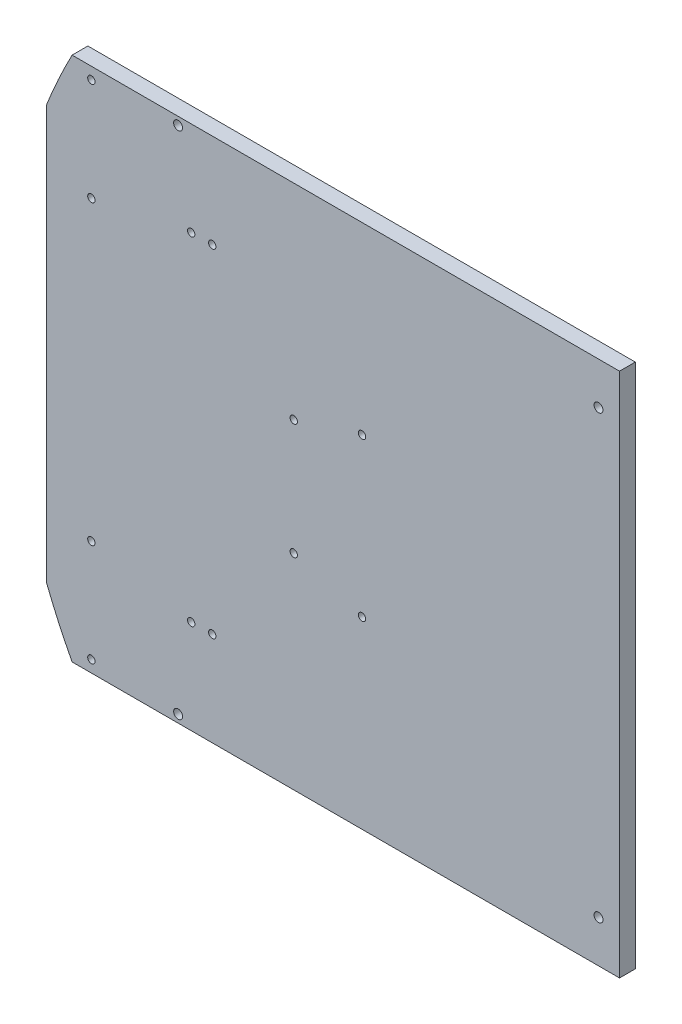
ISO-10303-21;
HEADER;
FILE_DESCRIPTION(('STEP AP214'),'2;1');
FILE_NAME('part.step','',(''),(''),'','','');
FILE_SCHEMA(('AUTOMOTIVE_DESIGN { 1 0 10303 214 1 1 1 1 }'));
ENDSEC;
DATA;
#1=APPLICATION_CONTEXT('core data for automotive mechanical design processes');
#2=APPLICATION_PROTOCOL_DEFINITION('international standard','automotive_design',2000,#1);
#3=PRODUCT_CONTEXT('',#1,'mechanical');
#4=PRODUCT('Part','Part','',(#3));
#5=PRODUCT_RELATED_PRODUCT_CATEGORY('part','',(#4));
#6=PRODUCT_DEFINITION_FORMATION('','',#4);
#7=PRODUCT_DEFINITION_CONTEXT('part definition',#1,'design');
#8=PRODUCT_DEFINITION('design','',#6,#7);
#9=PRODUCT_DEFINITION_SHAPE('','',#8);
#10=(LENGTH_UNIT() NAMED_UNIT(*) SI_UNIT(.MILLI.,.METRE.));
#11=(NAMED_UNIT(*) PLANE_ANGLE_UNIT() SI_UNIT($,.RADIAN.));
#12=(NAMED_UNIT(*) SI_UNIT($,.STERADIAN.) SOLID_ANGLE_UNIT());
#13=UNCERTAINTY_MEASURE_WITH_UNIT(LENGTH_MEASURE(1.E-05),#10,'distance_accuracy_value','');
#14=(GEOMETRIC_REPRESENTATION_CONTEXT(3) GLOBAL_UNCERTAINTY_ASSIGNED_CONTEXT((#13)) GLOBAL_UNIT_ASSIGNED_CONTEXT((#10,
#11,#12)) REPRESENTATION_CONTEXT('',''));
#15=CARTESIAN_POINT('',(0.,0.,0.));
#16=DIRECTION('',(0.,0.,1.));
#17=DIRECTION('',(1.,0.,0.));
#18=AXIS2_PLACEMENT_3D('',#15,#16,#17);
#19=CARTESIAN_POINT('',(10.,84.,239.3));
#20=DIRECTION('',(0.,0.,1.));
#21=DIRECTION('',(1.,0.,0.));
#22=AXIS2_PLACEMENT_3D('',#19,#20,#21);
#23=CYLINDRICAL_SURFACE('',#22,1.7);
#24=DIRECTION('',(0.,0.,1.));
#25=VECTOR('',#24,1.);
#26=CARTESIAN_POINT('',(11.7,84.,239.3));
#27=LINE('',#26,#25);
#28=CARTESIAN_POINT('',(11.7,84.,239.5));
#29=VERTEX_POINT('',#28);
#30=CARTESIAN_POINT('',(11.7,84.,245.5));
#31=VERTEX_POINT('',#30);
#32=EDGE_CURVE('E9',#29,#31,#27,.T.);
#33=ORIENTED_EDGE('',*,*,#32,.F.);
#34=CARTESIAN_POINT('',(10.,84.,239.5));
#35=DIRECTION('',(0.,0.,1.));
#36=DIRECTION('',(1.,0.,0.));
#37=AXIS2_PLACEMENT_3D('',#34,#35,#36);
#38=CIRCLE('',#37,1.7);
#39=EDGE_CURVE('E360',#29,#29,#38,.T.);
#40=ORIENTED_EDGE('',*,*,#39,.F.);
#41=ORIENTED_EDGE('',*,*,#32,.T.);
#42=CARTESIAN_POINT('',(10.,84.,245.5));
#43=DIRECTION('',(0.,0.,1.));
#44=DIRECTION('',(1.,0.,0.));
#45=AXIS2_PLACEMENT_3D('',#42,#43,#44);
#46=CIRCLE('',#45,1.7);
#47=EDGE_CURVE('E289',#31,#31,#46,.T.);
#48=ORIENTED_EDGE('',*,*,#47,.T.);
#49=EDGE_LOOP('',(#33,#40,#41,#48));
#50=FACE_BOUND('',#49,.T.);
#51=ADVANCED_FACE('F14',(#50),#23,.F.);
#52=CARTESIAN_POINT('',(-80.,30.,239.4));
#53=DIRECTION('',(0.,0.,1.));
#54=DIRECTION('',(1.,0.,0.));
#55=AXIS2_PLACEMENT_3D('',#52,#53,#54);
#56=CYLINDRICAL_SURFACE('',#55,1.4);
#57=DIRECTION('',(0.,0.,1.));
#58=VECTOR('',#57,1.);
#59=CARTESIAN_POINT('',(-78.6,30.,239.4));
#60=LINE('',#59,#58);
#61=CARTESIAN_POINT('',(-78.6,30.,239.5));
#62=VERTEX_POINT('',#61);
#63=CARTESIAN_POINT('',(-78.6,30.,245.5));
#64=VERTEX_POINT('',#63);
#65=EDGE_CURVE('E25',#62,#64,#60,.T.);
#66=ORIENTED_EDGE('',*,*,#65,.F.);
#67=CARTESIAN_POINT('',(-80.,30.,239.5));
#68=DIRECTION('',(0.,0.,1.));
#69=DIRECTION('',(1.,0.,0.));
#70=AXIS2_PLACEMENT_3D('',#67,#68,#69);
#71=CIRCLE('',#70,1.4);
#72=EDGE_CURVE('E365',#62,#62,#71,.T.);
#73=ORIENTED_EDGE('',*,*,#72,.F.);
#74=ORIENTED_EDGE('',*,*,#65,.T.);
#75=CARTESIAN_POINT('',(-80.,30.,245.5));
#76=DIRECTION('',(0.,0.,1.));
#77=DIRECTION('',(1.,0.,0.));
#78=AXIS2_PLACEMENT_3D('',#75,#76,#77);
#79=CIRCLE('',#78,1.4);
#80=EDGE_CURVE('E353',#64,#64,#79,.T.);
#81=ORIENTED_EDGE('',*,*,#80,.T.);
#82=EDGE_LOOP('',(#66,#73,#74,#81));
#83=FACE_BOUND('',#82,.T.);
#84=ADVANCED_FACE('F584',(#83),#56,.F.);
#85=CARTESIAN_POINT('',(-150.,97.,239.3));
#86=DIRECTION('',(0.,0.,1.));
#87=DIRECTION('',(1.,0.,0.));
#88=AXIS2_PLACEMENT_3D('',#85,#86,#87);
#89=CYLINDRICAL_SURFACE('',#88,1.7);
#90=DIRECTION('',(0.,0.,1.));
#91=VECTOR('',#90,1.);
#92=CARTESIAN_POINT('',(-148.3,97.,239.3));
#93=LINE('',#92,#91);
#94=CARTESIAN_POINT('',(-148.3,97.,239.5));
#95=VERTEX_POINT('',#94);
#96=CARTESIAN_POINT('',(-148.3,97.,245.5));
#97=VERTEX_POINT('',#96);
#98=EDGE_CURVE('E320',#95,#97,#93,.T.);
#99=ORIENTED_EDGE('',*,*,#98,.F.);
#100=CARTESIAN_POINT('',(-150.,97.,239.5));
#101=DIRECTION('',(0.,0.,1.));
#102=DIRECTION('',(1.,0.,0.));
#103=AXIS2_PLACEMENT_3D('',#100,#101,#102);
#104=CIRCLE('',#103,1.7);
#105=EDGE_CURVE('E458',#95,#95,#104,.T.);
#106=ORIENTED_EDGE('',*,*,#105,.F.);
#107=ORIENTED_EDGE('',*,*,#98,.T.);
#108=CARTESIAN_POINT('',(-150.,97.,245.5));
#109=DIRECTION('',(0.,0.,1.));
#110=DIRECTION('',(1.,0.,0.));
#111=AXIS2_PLACEMENT_3D('',#108,#109,#110);
#112=CIRCLE('',#111,1.7);
#113=EDGE_CURVE('E349',#97,#97,#112,.T.);
#114=ORIENTED_EDGE('',*,*,#113,.T.);
#115=EDGE_LOOP('',(#99,#106,#107,#114));
#116=FACE_BOUND('',#115,.T.);
#117=ADVANCED_FACE('F700',(#116),#89,.F.);
#118=CARTESIAN_POINT('',(-183.,95.5,239.4));
#119=DIRECTION('',(0.,0.,1.));
#120=DIRECTION('',(1.,0.,0.));
#121=AXIS2_PLACEMENT_3D('',#118,#119,#120);
#122=CYLINDRICAL_SURFACE('',#121,1.4);
#123=DIRECTION('',(0.,0.,1.));
#124=VECTOR('',#123,1.);
#125=CARTESIAN_POINT('',(-181.6,95.5,239.4));
#126=LINE('',#125,#124);
#127=CARTESIAN_POINT('',(-181.6,95.5,239.5));
#128=VERTEX_POINT('',#127);
#129=CARTESIAN_POINT('',(-181.6,95.5,245.5));
#130=VERTEX_POINT('',#129);
#131=EDGE_CURVE('E323',#128,#130,#126,.T.);
#132=ORIENTED_EDGE('',*,*,#131,.F.);
#133=CARTESIAN_POINT('',(-183.,95.5,239.5));
#134=DIRECTION('',(0.,0.,1.));
#135=DIRECTION('',(1.,0.,0.));
#136=AXIS2_PLACEMENT_3D('',#133,#134,#135);
#137=CIRCLE('',#136,1.4);
#138=EDGE_CURVE('E449',#128,#128,#137,.T.);
#139=ORIENTED_EDGE('',*,*,#138,.F.);
#140=ORIENTED_EDGE('',*,*,#131,.T.);
#141=CARTESIAN_POINT('',(-183.,95.5,245.5));
#142=DIRECTION('',(0.,0.,1.));
#143=DIRECTION('',(1.,0.,0.));
#144=AXIS2_PLACEMENT_3D('',#141,#142,#143);
#145=CIRCLE('',#144,1.4);
#146=EDGE_CURVE('E354',#130,#130,#145,.T.);
#147=ORIENTED_EDGE('',*,*,#146,.T.);
#148=EDGE_LOOP('',(#132,#139,#140,#147));
#149=FACE_BOUND('',#148,.T.);
#150=ADVANCED_FACE('F720',(#149),#122,.F.);
#151=CARTESIAN_POINT('',(-137.,64.2,239.4));
#152=DIRECTION('',(0.,0.,1.));
#153=DIRECTION('',(1.,0.,0.));
#154=AXIS2_PLACEMENT_3D('',#151,#152,#153);
#155=CYLINDRICAL_SURFACE('',#154,1.4);
#156=DIRECTION('',(0.,0.,1.));
#157=VECTOR('',#156,1.);
#158=CARTESIAN_POINT('',(-135.6,64.2,239.4));
#159=LINE('',#158,#157);
#160=CARTESIAN_POINT('',(-135.6,64.2,239.5));
#161=VERTEX_POINT('',#160);
#162=CARTESIAN_POINT('',(-135.6,64.2,245.5));
#163=VERTEX_POINT('',#162);
#164=EDGE_CURVE('E881',#161,#163,#159,.T.);
#165=ORIENTED_EDGE('',*,*,#164,.F.);
#166=CARTESIAN_POINT('',(-137.,64.2,239.5));
#167=DIRECTION('',(0.,0.,1.));
#168=DIRECTION('',(1.,0.,0.));
#169=AXIS2_PLACEMENT_3D('',#166,#167,#168);
#170=CIRCLE('',#169,1.4);
#171=EDGE_CURVE('E444',#161,#161,#170,.T.);
#172=ORIENTED_EDGE('',*,*,#171,.F.);
#173=ORIENTED_EDGE('',*,*,#164,.T.);
#174=CARTESIAN_POINT('',(-137.,64.2,245.5));
#175=DIRECTION('',(0.,0.,1.));
#176=DIRECTION('',(1.,0.,0.));
#177=AXIS2_PLACEMENT_3D('',#174,#175,#176);
#178=CIRCLE('',#177,1.4);
#179=EDGE_CURVE('E371',#163,#163,#178,.T.);
#180=ORIENTED_EDGE('',*,*,#179,.T.);
#181=EDGE_LOOP('',(#165,#172,#173,#180));
#182=FACE_BOUND('',#181,.T.);
#183=ADVANCED_FACE('F658',(#182),#155,.F.);
#184=CARTESIAN_POINT('',(-145.,64.2,239.4));
#185=DIRECTION('',(0.,0.,1.));
#186=DIRECTION('',(1.,0.,0.));
#187=AXIS2_PLACEMENT_3D('',#184,#185,#186);
#188=CYLINDRICAL_SURFACE('',#187,1.4);
#189=DIRECTION('',(0.,0.,1.));
#190=VECTOR('',#189,1.);
#191=CARTESIAN_POINT('',(-143.6,64.2,239.4));
#192=LINE('',#191,#190);
#193=CARTESIAN_POINT('',(-143.6,64.2,239.5));
#194=VERTEX_POINT('',#193);
#195=CARTESIAN_POINT('',(-143.6,64.2,245.5));
#196=VERTEX_POINT('',#195);
#197=EDGE_CURVE('E66',#194,#196,#192,.T.);
#198=ORIENTED_EDGE('',*,*,#197,.F.);
#199=CARTESIAN_POINT('',(-145.,64.2,239.5));
#200=DIRECTION('',(0.,0.,1.));
#201=DIRECTION('',(1.,0.,0.));
#202=AXIS2_PLACEMENT_3D('',#199,#200,#201);
#203=CIRCLE('',#202,1.4);
#204=EDGE_CURVE('E379',#194,#194,#203,.T.);
#205=ORIENTED_EDGE('',*,*,#204,.F.);
#206=ORIENTED_EDGE('',*,*,#197,.T.);
#207=CARTESIAN_POINT('',(-145.,64.2,245.5));
#208=DIRECTION('',(0.,0.,1.));
#209=DIRECTION('',(1.,0.,0.));
#210=AXIS2_PLACEMENT_3D('',#207,#208,#209);
#211=CIRCLE('',#210,1.4);
#212=EDGE_CURVE('E475',#196,#196,#211,.T.);
#213=ORIENTED_EDGE('',*,*,#212,.T.);
#214=EDGE_LOOP('',(#198,#205,#206,#213));
#215=FACE_BOUND('',#214,.T.);
#216=ADVANCED_FACE('F652',(#215),#188,.F.);
#217=CARTESIAN_POINT('',(-183.,56.5,239.4));
#218=DIRECTION('',(0.,0.,1.));
#219=DIRECTION('',(1.,0.,0.));
#220=AXIS2_PLACEMENT_3D('',#217,#218,#219);
#221=CYLINDRICAL_SURFACE('',#220,1.4);
#222=DIRECTION('',(0.,0.,1.));
#223=VECTOR('',#222,1.);
#224=CARTESIAN_POINT('',(-181.6,56.5,239.4));
#225=LINE('',#224,#223);
#226=CARTESIAN_POINT('',(-181.6,56.5,239.5));
#227=VERTEX_POINT('',#226);
#228=CARTESIAN_POINT('',(-181.6,56.5,245.5));
#229=VERTEX_POINT('',#228);
#230=EDGE_CURVE('E81',#227,#229,#225,.T.);
#231=ORIENTED_EDGE('',*,*,#230,.F.);
#232=CARTESIAN_POINT('',(-183.,56.5,239.5));
#233=DIRECTION('',(0.,0.,1.));
#234=DIRECTION('',(1.,0.,0.));
#235=AXIS2_PLACEMENT_3D('',#232,#233,#234);
#236=CIRCLE('',#235,1.4);
#237=EDGE_CURVE('E375',#227,#227,#236,.T.);
#238=ORIENTED_EDGE('',*,*,#237,.F.);
#239=ORIENTED_EDGE('',*,*,#230,.T.);
#240=CARTESIAN_POINT('',(-183.,56.5,245.5));
#241=DIRECTION('',(0.,0.,1.));
#242=DIRECTION('',(1.,0.,0.));
#243=AXIS2_PLACEMENT_3D('',#240,#241,#242);
#244=CIRCLE('',#243,1.4);
#245=EDGE_CURVE('E477',#229,#229,#244,.T.);
#246=ORIENTED_EDGE('',*,*,#245,.T.);
#247=EDGE_LOOP('',(#231,#238,#239,#246));
#248=FACE_BOUND('',#247,.T.);
#249=ADVANCED_FACE('F657',(#248),#221,.F.);
#250=CARTESIAN_POINT('',(-106.,22.,239.4));
#251=DIRECTION('',(0.,0.,1.));
#252=DIRECTION('',(1.,0.,0.));
#253=AXIS2_PLACEMENT_3D('',#250,#251,#252);
#254=CYLINDRICAL_SURFACE('',#253,1.4);
#255=DIRECTION('',(0.,0.,1.));
#256=VECTOR('',#255,1.);
#257=CARTESIAN_POINT('',(-104.6,22.,239.4));
#258=LINE('',#257,#256);
#259=CARTESIAN_POINT('',(-104.6,22.,239.5));
#260=VERTEX_POINT('',#259);
#261=CARTESIAN_POINT('',(-104.6,22.,245.5));
#262=VERTEX_POINT('',#261);
#263=EDGE_CURVE('E261',#260,#262,#258,.T.);
#264=ORIENTED_EDGE('',*,*,#263,.F.);
#265=CARTESIAN_POINT('',(-106.,22.,239.5));
#266=DIRECTION('',(0.,0.,1.));
#267=DIRECTION('',(1.,0.,0.));
#268=AXIS2_PLACEMENT_3D('',#265,#266,#267);
#269=CIRCLE('',#268,1.4);
#270=EDGE_CURVE('E18',#260,#260,#269,.T.);
#271=ORIENTED_EDGE('',*,*,#270,.F.);
#272=ORIENTED_EDGE('',*,*,#263,.T.);
#273=CARTESIAN_POINT('',(-106.,22.,245.5));
#274=DIRECTION('',(0.,0.,1.));
#275=DIRECTION('',(1.,0.,0.));
#276=AXIS2_PLACEMENT_3D('',#273,#274,#275);
#277=CIRCLE('',#276,1.4);
#278=EDGE_CURVE('E383',#262,#262,#277,.T.);
#279=ORIENTED_EDGE('',*,*,#278,.T.);
#280=EDGE_LOOP('',(#264,#271,#272,#279));
#281=FACE_BOUND('',#280,.T.);
#282=ADVANCED_FACE('F523',(#281),#254,.F.);
#283=CARTESIAN_POINT('',(-80.,-30.,239.4));
#284=DIRECTION('',(0.,0.,1.));
#285=DIRECTION('',(1.,0.,0.));
#286=AXIS2_PLACEMENT_3D('',#283,#284,#285);
#287=CYLINDRICAL_SURFACE('',#286,1.4);
#288=DIRECTION('',(0.,0.,1.));
#289=VECTOR('',#288,1.);
#290=CARTESIAN_POINT('',(-78.6,-30.,239.4));
#291=LINE('',#290,#289);
#292=CARTESIAN_POINT('',(-78.6,-30.,239.5));
#293=VERTEX_POINT('',#292);
#294=CARTESIAN_POINT('',(-78.6,-30.,245.5));
#295=VERTEX_POINT('',#294);
#296=EDGE_CURVE('E251',#293,#295,#291,.T.);
#297=ORIENTED_EDGE('',*,*,#296,.F.);
#298=CARTESIAN_POINT('',(-80.,-30.,239.5));
#299=DIRECTION('',(0.,0.,1.));
#300=DIRECTION('',(1.,0.,0.));
#301=AXIS2_PLACEMENT_3D('',#298,#299,#300);
#302=CIRCLE('',#301,1.4);
#303=EDGE_CURVE('E308',#293,#293,#302,.T.);
#304=ORIENTED_EDGE('',*,*,#303,.F.);
#305=ORIENTED_EDGE('',*,*,#296,.T.);
#306=CARTESIAN_POINT('',(-80.,-30.,245.5));
#307=DIRECTION('',(0.,0.,1.));
#308=DIRECTION('',(1.,0.,0.));
#309=AXIS2_PLACEMENT_3D('',#306,#307,#308);
#310=CIRCLE('',#309,1.4);
#311=EDGE_CURVE('E380',#295,#295,#310,.T.);
#312=ORIENTED_EDGE('',*,*,#311,.T.);
#313=EDGE_LOOP('',(#297,#304,#305,#312));
#314=FACE_BOUND('',#313,.T.);
#315=ADVANCED_FACE('F551',(#314),#287,.F.);
#316=CARTESIAN_POINT('',(10.,-84.,239.3));
#317=DIRECTION('',(0.,0.,1.));
#318=DIRECTION('',(1.,0.,0.));
#319=AXIS2_PLACEMENT_3D('',#316,#317,#318);
#320=CYLINDRICAL_SURFACE('',#319,1.7);
#321=DIRECTION('',(0.,0.,1.));
#322=VECTOR('',#321,1.);
#323=CARTESIAN_POINT('',(11.7,-84.,239.3));
#324=LINE('',#323,#322);
#325=CARTESIAN_POINT('',(11.7,-84.,239.5));
#326=VERTEX_POINT('',#325);
#327=CARTESIAN_POINT('',(11.7,-84.,245.5));
#328=VERTEX_POINT('',#327);
#329=EDGE_CURVE('E244',#326,#328,#324,.T.);
#330=ORIENTED_EDGE('',*,*,#329,.F.);
#331=CARTESIAN_POINT('',(10.,-84.,239.5));
#332=DIRECTION('',(0.,0.,1.));
#333=DIRECTION('',(1.,0.,0.));
#334=AXIS2_PLACEMENT_3D('',#331,#332,#333);
#335=CIRCLE('',#334,1.7);
#336=EDGE_CURVE('E304',#326,#326,#335,.T.);
#337=ORIENTED_EDGE('',*,*,#336,.F.);
#338=ORIENTED_EDGE('',*,*,#329,.T.);
#339=CARTESIAN_POINT('',(10.,-84.,245.5));
#340=DIRECTION('',(0.,0.,1.));
#341=DIRECTION('',(1.,0.,0.));
#342=AXIS2_PLACEMENT_3D('',#339,#340,#341);
#343=CIRCLE('',#342,1.7);
#344=EDGE_CURVE('E384',#328,#328,#343,.T.);
#345=ORIENTED_EDGE('',*,*,#344,.T.);
#346=EDGE_LOOP('',(#330,#337,#338,#345));
#347=FACE_BOUND('',#346,.T.);
#348=ADVANCED_FACE('F556',(#347),#320,.F.);
#349=CARTESIAN_POINT('',(-106.,-22.,239.4));
#350=DIRECTION('',(0.,0.,1.));
#351=DIRECTION('',(1.,0.,0.));
#352=AXIS2_PLACEMENT_3D('',#349,#350,#351);
#353=CYLINDRICAL_SURFACE('',#352,1.4);
#354=DIRECTION('',(0.,0.,1.));
#355=VECTOR('',#354,1.);
#356=CARTESIAN_POINT('',(-104.6,-22.,239.4));
#357=LINE('',#356,#355);
#358=CARTESIAN_POINT('',(-104.6,-22.,239.5));
#359=VERTEX_POINT('',#358);
#360=CARTESIAN_POINT('',(-104.6,-22.,245.5));
#361=VERTEX_POINT('',#360);
#362=EDGE_CURVE('E238',#359,#361,#357,.T.);
#363=ORIENTED_EDGE('',*,*,#362,.F.);
#364=CARTESIAN_POINT('',(-106.,-22.,239.5));
#365=DIRECTION('',(0.,0.,1.));
#366=DIRECTION('',(1.,0.,0.));
#367=AXIS2_PLACEMENT_3D('',#364,#365,#366);
#368=CIRCLE('',#367,1.4);
#369=EDGE_CURVE('E242',#359,#359,#368,.T.);
#370=ORIENTED_EDGE('',*,*,#369,.F.);
#371=ORIENTED_EDGE('',*,*,#362,.T.);
#372=CARTESIAN_POINT('',(-106.,-22.,245.5));
#373=DIRECTION('',(0.,0.,1.));
#374=DIRECTION('',(1.,0.,0.));
#375=AXIS2_PLACEMENT_3D('',#372,#373,#374);
#376=CIRCLE('',#375,1.4);
#377=EDGE_CURVE('E240',#361,#361,#376,.T.);
#378=ORIENTED_EDGE('',*,*,#377,.T.);
#379=EDGE_LOOP('',(#363,#370,#371,#378));
#380=FACE_BOUND('',#379,.T.);
#381=ADVANCED_FACE('F16',(#380),#353,.F.);
#382=CARTESIAN_POINT('',(-137.,-64.2,239.4));
#383=DIRECTION('',(0.,0.,1.));
#384=DIRECTION('',(1.,0.,0.));
#385=AXIS2_PLACEMENT_3D('',#382,#383,#384);
#386=CYLINDRICAL_SURFACE('',#385,1.4);
#387=DIRECTION('',(0.,0.,1.));
#388=VECTOR('',#387,1.);
#389=CARTESIAN_POINT('',(-135.6,-64.2,239.4));
#390=LINE('',#389,#388);
#391=CARTESIAN_POINT('',(-135.6,-64.2,239.5));
#392=VERTEX_POINT('',#391);
#393=CARTESIAN_POINT('',(-135.6,-64.2,245.5));
#394=VERTEX_POINT('',#393);
#395=EDGE_CURVE('E245',#392,#394,#390,.T.);
#396=ORIENTED_EDGE('',*,*,#395,.F.);
#397=CARTESIAN_POINT('',(-137.,-64.2,239.5));
#398=DIRECTION('',(0.,0.,1.));
#399=DIRECTION('',(1.,0.,0.));
#400=AXIS2_PLACEMENT_3D('',#397,#398,#399);
#401=CIRCLE('',#400,1.4);
#402=EDGE_CURVE('E311',#392,#392,#401,.T.);
#403=ORIENTED_EDGE('',*,*,#402,.F.);
#404=ORIENTED_EDGE('',*,*,#395,.T.);
#405=CARTESIAN_POINT('',(-137.,-64.2,245.5));
#406=DIRECTION('',(0.,0.,1.));
#407=DIRECTION('',(1.,0.,0.));
#408=AXIS2_PLACEMENT_3D('',#405,#406,#407);
#409=CIRCLE('',#408,1.4);
#410=EDGE_CURVE('E258',#394,#394,#409,.T.);
#411=ORIENTED_EDGE('',*,*,#410,.T.);
#412=EDGE_LOOP('',(#396,#403,#404,#411));
#413=FACE_BOUND('',#412,.T.);
#414=ADVANCED_FACE('F607',(#413),#386,.F.);
#415=CARTESIAN_POINT('',(-145.,-64.2,239.4));
#416=DIRECTION('',(0.,0.,1.));
#417=DIRECTION('',(1.,0.,0.));
#418=AXIS2_PLACEMENT_3D('',#415,#416,#417);
#419=CYLINDRICAL_SURFACE('',#418,1.4);
#420=DIRECTION('',(0.,0.,1.));
#421=VECTOR('',#420,1.);
#422=CARTESIAN_POINT('',(-143.6,-64.2,239.4));
#423=LINE('',#422,#421);
#424=CARTESIAN_POINT('',(-143.6,-64.2,239.5));
#425=VERTEX_POINT('',#424);
#426=CARTESIAN_POINT('',(-143.6,-64.2,245.5));
#427=VERTEX_POINT('',#426);
#428=EDGE_CURVE('E254',#425,#427,#423,.T.);
#429=ORIENTED_EDGE('',*,*,#428,.F.);
#430=CARTESIAN_POINT('',(-145.,-64.2,239.5));
#431=DIRECTION('',(0.,0.,1.));
#432=DIRECTION('',(1.,0.,0.));
#433=AXIS2_PLACEMENT_3D('',#430,#431,#432);
#434=CIRCLE('',#433,1.4);
#435=EDGE_CURVE('E355',#425,#425,#434,.T.);
#436=ORIENTED_EDGE('',*,*,#435,.F.);
#437=ORIENTED_EDGE('',*,*,#428,.T.);
#438=CARTESIAN_POINT('',(-145.,-64.2,245.5));
#439=DIRECTION('',(0.,0.,1.));
#440=DIRECTION('',(1.,0.,0.));
#441=AXIS2_PLACEMENT_3D('',#438,#439,#440);
#442=CIRCLE('',#441,1.4);
#443=EDGE_CURVE('E324',#427,#427,#442,.T.);
#444=ORIENTED_EDGE('',*,*,#443,.T.);
#445=EDGE_LOOP('',(#429,#436,#437,#444));
#446=FACE_BOUND('',#445,.T.);
#447=ADVANCED_FACE('F601',(#446),#419,.F.);
#448=CARTESIAN_POINT('',(-183.,-56.5,239.4));
#449=DIRECTION('',(0.,0.,1.));
#450=DIRECTION('',(1.,0.,0.));
#451=AXIS2_PLACEMENT_3D('',#448,#449,#450);
#452=CYLINDRICAL_SURFACE('',#451,1.4);
#453=DIRECTION('',(0.,0.,1.));
#454=VECTOR('',#453,1.);
#455=CARTESIAN_POINT('',(-181.6,-56.5,239.4));
#456=LINE('',#455,#454);
#457=CARTESIAN_POINT('',(-181.6,-56.5,239.5));
#458=VERTEX_POINT('',#457);
#459=CARTESIAN_POINT('',(-181.6,-56.5,245.5));
#460=VERTEX_POINT('',#459);
#461=EDGE_CURVE('E276',#458,#460,#456,.T.);
#462=ORIENTED_EDGE('',*,*,#461,.F.);
#463=CARTESIAN_POINT('',(-183.,-56.5,239.5));
#464=DIRECTION('',(0.,0.,1.));
#465=DIRECTION('',(1.,0.,0.));
#466=AXIS2_PLACEMENT_3D('',#463,#464,#465);
#467=CIRCLE('',#466,1.4);
#468=EDGE_CURVE('E359',#458,#458,#467,.T.);
#469=ORIENTED_EDGE('',*,*,#468,.F.);
#470=ORIENTED_EDGE('',*,*,#461,.T.);
#471=CARTESIAN_POINT('',(-183.,-56.5,245.5));
#472=DIRECTION('',(0.,0.,1.));
#473=DIRECTION('',(1.,0.,0.));
#474=AXIS2_PLACEMENT_3D('',#471,#472,#473);
#475=CIRCLE('',#474,1.4);
#476=EDGE_CURVE('E328',#460,#460,#475,.T.);
#477=ORIENTED_EDGE('',*,*,#476,.T.);
#478=EDGE_LOOP('',(#462,#469,#470,#477));
#479=FACE_BOUND('',#478,.T.);
#480=ADVANCED_FACE('F606',(#479),#452,.F.);
#481=CARTESIAN_POINT('',(-150.,-97.,239.3));
#482=DIRECTION('',(0.,0.,1.));
#483=DIRECTION('',(1.,0.,0.));
#484=AXIS2_PLACEMENT_3D('',#481,#482,#483);
#485=CYLINDRICAL_SURFACE('',#484,1.7);
#486=DIRECTION('',(0.,0.,1.));
#487=VECTOR('',#486,1.);
#488=CARTESIAN_POINT('',(-148.3,-97.,239.3));
#489=LINE('',#488,#487);
#490=CARTESIAN_POINT('',(-148.3,-97.,239.5));
#491=VERTEX_POINT('',#490);
#492=CARTESIAN_POINT('',(-148.3,-97.,245.5));
#493=VERTEX_POINT('',#492);
#494=EDGE_CURVE('E272',#491,#493,#489,.T.);
#495=ORIENTED_EDGE('',*,*,#494,.F.);
#496=CARTESIAN_POINT('',(-150.,-97.,239.5));
#497=DIRECTION('',(0.,0.,1.));
#498=DIRECTION('',(1.,0.,0.));
#499=AXIS2_PLACEMENT_3D('',#496,#497,#498);
#500=CIRCLE('',#499,1.7);
#501=EDGE_CURVE('E515',#491,#491,#500,.T.);
#502=ORIENTED_EDGE('',*,*,#501,.F.);
#503=ORIENTED_EDGE('',*,*,#494,.T.);
#504=CARTESIAN_POINT('',(-150.,-97.,245.5));
#505=DIRECTION('',(0.,0.,1.));
#506=DIRECTION('',(1.,0.,0.));
#507=AXIS2_PLACEMENT_3D('',#504,#505,#506);
#508=CIRCLE('',#507,1.7);
#509=EDGE_CURVE('E419',#493,#493,#508,.T.);
#510=ORIENTED_EDGE('',*,*,#509,.T.);
#511=EDGE_LOOP('',(#495,#502,#503,#510));
#512=FACE_BOUND('',#511,.T.);
#513=ADVANCED_FACE('F743',(#512),#485,.F.);
#514=CARTESIAN_POINT('',(-183.,-95.5,239.4));
#515=DIRECTION('',(0.,0.,1.));
#516=DIRECTION('',(1.,0.,0.));
#517=AXIS2_PLACEMENT_3D('',#514,#515,#516);
#518=CYLINDRICAL_SURFACE('',#517,1.4);
#519=DIRECTION('',(0.,0.,1.));
#520=VECTOR('',#519,1.);
#521=CARTESIAN_POINT('',(-181.6,-95.5,239.4));
#522=LINE('',#521,#520);
#523=CARTESIAN_POINT('',(-181.6,-95.5,239.5));
#524=VERTEX_POINT('',#523);
#525=CARTESIAN_POINT('',(-181.6,-95.5,245.5));
#526=VERTEX_POINT('',#525);
#527=EDGE_CURVE('E277',#524,#526,#522,.T.);
#528=ORIENTED_EDGE('',*,*,#527,.F.);
#529=CARTESIAN_POINT('',(-183.,-95.5,239.5));
#530=DIRECTION('',(0.,0.,1.));
#531=DIRECTION('',(1.,0.,0.));
#532=AXIS2_PLACEMENT_3D('',#529,#530,#531);
#533=CIRCLE('',#532,1.4);
#534=EDGE_CURVE('E408',#524,#524,#533,.T.);
#535=ORIENTED_EDGE('',*,*,#534,.F.);
#536=ORIENTED_EDGE('',*,*,#527,.T.);
#537=CARTESIAN_POINT('',(-183.,-95.5,245.5));
#538=DIRECTION('',(0.,0.,1.));
#539=DIRECTION('',(1.,0.,0.));
#540=AXIS2_PLACEMENT_3D('',#537,#538,#539);
#541=CIRCLE('',#540,1.4);
#542=EDGE_CURVE('E265',#526,#526,#541,.T.);
#543=ORIENTED_EDGE('',*,*,#542,.T.);
#544=EDGE_LOOP('',(#528,#535,#536,#543));
#545=FACE_BOUND('',#544,.T.);
#546=ADVANCED_FACE('F737',(#545),#518,.F.);
#547=CARTESIAN_POINT('',(-200.,-78.89810133986,239.5));
#548=DIRECTION('',(0.925459729868298,0.378845995613122,0.));
#549=DIRECTION('',(0.,0.,-1.));
#550=AXIS2_PLACEMENT_3D('',#547,#548,#549);
#551=PLANE('',#550);
#552=DIRECTION('',(0.378845995613122,-0.925459729868298,0.));
#553=VECTOR('',#552,1.);
#554=CARTESIAN_POINT('',(-200.,-78.89810133986,239.5));
#555=LINE('',#554,#553);
#556=CARTESIAN_POINT('',(-200.,-78.89810133986,239.5));
#557=VERTEX_POINT('',#556);
#558=CARTESIAN_POINT('',(-197.9085434922,-84.00719262519,239.5));
#559=VERTEX_POINT('',#558);
#560=EDGE_CURVE('E464',#557,#559,#555,.T.);
#561=ORIENTED_EDGE('',*,*,#560,.T.);
#562=DIRECTION('',(0.,0.,1.));
#563=VECTOR('',#562,1.);
#564=CARTESIAN_POINT('',(-197.9085434922,-84.00719262519,239.5));
#565=LINE('',#564,#563);
#566=CARTESIAN_POINT('',(-197.9085434922,-84.00719262519,245.5));
#567=VERTEX_POINT('',#566);
#568=EDGE_CURVE('E267',#559,#567,#565,.T.);
#569=ORIENTED_EDGE('',*,*,#568,.T.);
#570=DIRECTION('',(0.378845995613122,-0.925459729868298,0.));
#571=VECTOR('',#570,1.);
#572=CARTESIAN_POINT('',(-200.,-78.89810133986,245.5));
#573=LINE('',#572,#571);
#574=CARTESIAN_POINT('',(-200.,-78.89810133986,245.5));
#575=VERTEX_POINT('',#574);
#576=EDGE_CURVE('E294',#575,#567,#573,.T.);
#577=ORIENTED_EDGE('',*,*,#576,.F.);
#578=DIRECTION('',(0.,0.,1.));
#579=VECTOR('',#578,1.);
#580=CARTESIAN_POINT('',(-200.,-78.89810133986,239.5));
#581=LINE('',#580,#579);
#582=EDGE_CURVE('E270',#557,#575,#581,.T.);
#583=ORIENTED_EDGE('',*,*,#582,.F.);
#584=EDGE_LOOP('',(#561,#569,#577,#583));
#585=FACE_BOUND('',#584,.T.);
#586=ADVANCED_FACE('F742',(#585),#551,.F.);
#587=CARTESIAN_POINT('',(-200.,78.898101339862,239.5));
#588=DIRECTION('',(1.,0.,0.));
#589=DIRECTION('',(0.,1.,0.));
#590=AXIS2_PLACEMENT_3D('',#587,#588,#589);
#591=PLANE('',#590);
#592=DIRECTION('',(0.,-1.,0.));
#593=VECTOR('',#592,1.);
#594=CARTESIAN_POINT('',(-200.,78.898101339862,239.5));
#595=LINE('',#594,#593);
#596=CARTESIAN_POINT('',(-200.,78.898101339862,239.5));
#597=VERTEX_POINT('',#596);
#598=EDGE_CURVE('E418',#597,#557,#595,.T.);
#599=ORIENTED_EDGE('',*,*,#598,.T.);
#600=ORIENTED_EDGE('',*,*,#582,.T.);
#601=DIRECTION('',(0.,-1.,0.));
#602=VECTOR('',#601,1.);
#603=CARTESIAN_POINT('',(-200.,78.898101339862,245.5));
#604=LINE('',#603,#602);
#605=CARTESIAN_POINT('',(-200.,78.898101339862,245.5));
#606=VERTEX_POINT('',#605);
#607=EDGE_CURVE('E290',#606,#575,#604,.T.);
#608=ORIENTED_EDGE('',*,*,#607,.F.);
#609=DIRECTION('',(0.,0.,1.));
#610=VECTOR('',#609,1.);
#611=CARTESIAN_POINT('',(-200.,78.898101339862,239.5));
#612=LINE('',#611,#610);
#613=EDGE_CURVE('E271',#597,#606,#612,.T.);
#614=ORIENTED_EDGE('',*,*,#613,.F.);
#615=EDGE_LOOP('',(#599,#600,#608,#614));
#616=FACE_BOUND('',#615,.T.);
#617=ADVANCED_FACE('F621',(#616),#591,.F.);
#618=CARTESIAN_POINT('',(-197.9085434922,-84.00719262519,239.5));
#619=DIRECTION('',(0.915311479119278,0.402746689859122,0.));
#620=DIRECTION('',(0.,0.,-1.));
#621=AXIS2_PLACEMENT_3D('',#618,#619,#620);
#622=PLANE('',#621);
#623=DIRECTION('',(0.402746689859122,-0.915311479119278,0.));
#624=VECTOR('',#623,1.);
#625=CARTESIAN_POINT('',(-197.9085434922,-84.00719262519,239.5));
#626=LINE('',#625,#624);
#627=CARTESIAN_POINT('',(-195.6416732384,-89.15904717109,239.5));
#628=VERTEX_POINT('',#627);
#629=EDGE_CURVE('E482',#559,#628,#626,.T.);
#630=ORIENTED_EDGE('',*,*,#629,.T.);
#631=DIRECTION('',(0.,0.,1.));
#632=VECTOR('',#631,1.);
#633=CARTESIAN_POINT('',(-195.6416732384,-89.15904717109,239.5));
#634=LINE('',#633,#632);
#635=CARTESIAN_POINT('',(-195.6416732384,-89.15904717109,245.5));
#636=VERTEX_POINT('',#635);
#637=EDGE_CURVE('E278',#628,#636,#634,.T.);
#638=ORIENTED_EDGE('',*,*,#637,.T.);
#639=DIRECTION('',(0.402746689859122,-0.915311479119278,0.));
#640=VECTOR('',#639,1.);
#641=CARTESIAN_POINT('',(-197.9085434922,-84.00719262519,245.5));
#642=LINE('',#641,#640);
#643=EDGE_CURVE('E348',#567,#636,#642,.T.);
#644=ORIENTED_EDGE('',*,*,#643,.F.);
#645=ORIENTED_EDGE('',*,*,#568,.F.);
#646=EDGE_LOOP('',(#630,#638,#644,#645));
#647=FACE_BOUND('',#646,.T.);
#648=ADVANCED_FACE('F616',(#647),#622,.F.);
#649=CARTESIAN_POINT('',(-197.9085434922,84.007192625194,239.5));
#650=DIRECTION('',(0.925459729868298,-0.378845995613122,0.));
#651=DIRECTION('',(0.,0.,-1.));
#652=AXIS2_PLACEMENT_3D('',#649,#650,#651);
#653=PLANE('',#652);
#654=DIRECTION('',(-0.378845995613122,-0.925459729868298,0.));
#655=VECTOR('',#654,1.);
#656=CARTESIAN_POINT('',(-197.9085434922,84.007192625194,239.5));
#657=LINE('',#656,#655);
#658=CARTESIAN_POINT('',(-197.9085434922,84.007192625194,239.5));
#659=VERTEX_POINT('',#658);
#660=EDGE_CURVE('E415',#659,#597,#657,.T.);
#661=ORIENTED_EDGE('',*,*,#660,.T.);
#662=ORIENTED_EDGE('',*,*,#613,.T.);
#663=DIRECTION('',(-0.378845995613122,-0.925459729868298,0.));
#664=VECTOR('',#663,1.);
#665=CARTESIAN_POINT('',(-197.9085434922,84.007192625194,245.5));
#666=LINE('',#665,#664);
#667=CARTESIAN_POINT('',(-197.9085434922,84.007192625194,245.5));
#668=VERTEX_POINT('',#667);
#669=EDGE_CURVE('E295',#668,#606,#666,.T.);
#670=ORIENTED_EDGE('',*,*,#669,.F.);
#671=DIRECTION('',(0.,0.,1.));
#672=VECTOR('',#671,1.);
#673=CARTESIAN_POINT('',(-197.9085434922,84.007192625194,239.5));
#674=LINE('',#673,#672);
#675=EDGE_CURVE('E282',#659,#668,#674,.T.);
#676=ORIENTED_EDGE('',*,*,#675,.F.);
#677=EDGE_LOOP('',(#661,#662,#670,#676));
#678=FACE_BOUND('',#677,.T.);
#679=ADVANCED_FACE('F571',(#678),#653,.F.);
#680=CARTESIAN_POINT('',(-195.6416732384,-89.15904717109,239.5));
#681=DIRECTION('',(0.904455145454478,0.426568739901225,0.));
#682=DIRECTION('',(0.,0.,-1.));
#683=AXIS2_PLACEMENT_3D('',#680,#681,#682);
#684=PLANE('',#683);
#685=DIRECTION('',(0.426568739901225,-0.904455145454478,0.));
#686=VECTOR('',#685,1.);
#687=CARTESIAN_POINT('',(-195.6416732384,-89.15904717109,239.5));
#688=LINE('',#687,#686);
#689=CARTESIAN_POINT('',(-193.2407199543,-94.24979655965,239.5));
#690=VERTEX_POINT('',#689);
#691=EDGE_CURVE('E500',#628,#690,#688,.T.);
#692=ORIENTED_EDGE('',*,*,#691,.T.);
#693=DIRECTION('',(0.,0.,1.));
#694=VECTOR('',#693,1.);
#695=CARTESIAN_POINT('',(-193.2407199543,-94.24979655965,239.5));
#696=LINE('',#695,#694);
#697=CARTESIAN_POINT('',(-193.2407199543,-94.24979655965,245.5));
#698=VERTEX_POINT('',#697);
#699=EDGE_CURVE('E296',#690,#698,#696,.T.);
#700=ORIENTED_EDGE('',*,*,#699,.T.);
#701=DIRECTION('',(0.426568739901225,-0.904455145454478,0.));
#702=VECTOR('',#701,1.);
#703=CARTESIAN_POINT('',(-195.6416732384,-89.15904717109,245.5));
#704=LINE('',#703,#702);
#705=EDGE_CURVE('E468',#636,#698,#704,.T.);
#706=ORIENTED_EDGE('',*,*,#705,.F.);
#707=ORIENTED_EDGE('',*,*,#637,.F.);
#708=EDGE_LOOP('',(#692,#700,#706,#707));
#709=FACE_BOUND('',#708,.T.);
#710=ADVANCED_FACE('F565',(#709),#684,.F.);
#711=CARTESIAN_POINT('',(-195.6416732384,89.159047171091,239.5));
#712=DIRECTION('',(0.915311479119278,-0.402746689859122,0.));
#713=DIRECTION('',(0.,0.,-1.));
#714=AXIS2_PLACEMENT_3D('',#711,#712,#713);
#715=PLANE('',#714);
#716=DIRECTION('',(-0.402746689859122,-0.915311479119278,0.));
#717=VECTOR('',#716,1.);
#718=CARTESIAN_POINT('',(-195.6416732384,89.159047171091,239.5));
#719=LINE('',#718,#717);
#720=CARTESIAN_POINT('',(-195.6416732384,89.159047171091,239.5));
#721=VERTEX_POINT('',#720);
#722=EDGE_CURVE('E409',#721,#659,#719,.T.);
#723=ORIENTED_EDGE('',*,*,#722,.T.);
#724=ORIENTED_EDGE('',*,*,#675,.T.);
#725=DIRECTION('',(-0.402746689859122,-0.915311479119278,0.));
#726=VECTOR('',#725,1.);
#727=CARTESIAN_POINT('',(-195.6416732384,89.159047171091,245.5));
#728=LINE('',#727,#726);
#729=CARTESIAN_POINT('',(-195.6416732384,89.159047171091,245.5));
#730=VERTEX_POINT('',#729);
#731=EDGE_CURVE('E439',#730,#668,#728,.T.);
#732=ORIENTED_EDGE('',*,*,#731,.F.);
#733=DIRECTION('',(0.,0.,1.));
#734=VECTOR('',#733,1.);
#735=CARTESIAN_POINT('',(-195.6416732384,89.159047171091,239.5));
#736=LINE('',#735,#734);
#737=EDGE_CURVE('E288',#721,#730,#736,.T.);
#738=ORIENTED_EDGE('',*,*,#737,.F.);
#739=EDGE_LOOP('',(#723,#724,#732,#738));
#740=FACE_BOUND('',#739,.T.);
#741=ADVANCED_FACE('F570',(#740),#715,.F.);
#742=CARTESIAN_POINT('',(-193.2407199543,-94.24979655965,239.5));
#743=DIRECTION('',(0.892105820085702,0.451826521763849,0.));
#744=DIRECTION('',(0.,0.,-1.));
#745=AXIS2_PLACEMENT_3D('',#742,#743,#744);
#746=PLANE('',#745);
#747=DIRECTION('',(0.451826521763849,-0.892105820085702,0.));
#748=VECTOR('',#747,1.);
#749=CARTESIAN_POINT('',(-193.2407199543,-94.24979655965,239.5));
#750=LINE('',#749,#748);
#751=CARTESIAN_POINT('',(-190.3284035436,-100.,239.5));
#752=VERTEX_POINT('',#751);
#753=EDGE_CURVE('E344',#690,#752,#750,.T.);
#754=ORIENTED_EDGE('',*,*,#753,.T.);
#755=DIRECTION('',(0.,0.,1.));
#756=VECTOR('',#755,1.);
#757=CARTESIAN_POINT('',(-190.3284035436,-100.,239.5));
#758=LINE('',#757,#756);
#759=CARTESIAN_POINT('',(-190.3284035436,-100.,245.5));
#760=VERTEX_POINT('',#759);
#761=EDGE_CURVE('E285',#752,#760,#758,.T.);
#762=ORIENTED_EDGE('',*,*,#761,.T.);
#763=DIRECTION('',(0.451826521763849,-0.892105820085702,0.));
#764=VECTOR('',#763,1.);
#765=CARTESIAN_POINT('',(-193.2407199543,-94.24979655965,245.5));
#766=LINE('',#765,#764);
#767=EDGE_CURVE('E266',#698,#760,#766,.T.);
#768=ORIENTED_EDGE('',*,*,#767,.F.);
#769=ORIENTED_EDGE('',*,*,#699,.F.);
#770=EDGE_LOOP('',(#754,#762,#768,#769));
#771=FACE_BOUND('',#770,.T.);
#772=ADVANCED_FACE('F639',(#771),#746,.F.);
#773=CARTESIAN_POINT('',(-193.2407199543,94.249796559652,239.5));
#774=DIRECTION('',(0.904455145454478,-0.426568739901225,0.));
#775=DIRECTION('',(0.,0.,-1.));
#776=AXIS2_PLACEMENT_3D('',#773,#774,#775);
#777=PLANE('',#776);
#778=DIRECTION('',(-0.426568739901225,-0.904455145454478,0.));
#779=VECTOR('',#778,1.);
#780=CARTESIAN_POINT('',(-193.2407199543,94.249796559652,239.5));
#781=LINE('',#780,#779);
#782=CARTESIAN_POINT('',(-193.2407199543,94.249796559652,239.5));
#783=VERTEX_POINT('',#782);
#784=EDGE_CURVE('E405',#783,#721,#781,.T.);
#785=ORIENTED_EDGE('',*,*,#784,.T.);
#786=ORIENTED_EDGE('',*,*,#737,.T.);
#787=DIRECTION('',(-0.426568739901225,-0.904455145454478,0.));
#788=VECTOR('',#787,1.);
#789=CARTESIAN_POINT('',(-193.2407199543,94.249796559652,245.5));
#790=LINE('',#789,#788);
#791=CARTESIAN_POINT('',(-193.2407199543,94.249796559652,245.5));
#792=VERTEX_POINT('',#791);
#793=EDGE_CURVE('E364',#792,#730,#790,.T.);
#794=ORIENTED_EDGE('',*,*,#793,.F.);
#795=DIRECTION('',(0.,0.,1.));
#796=VECTOR('',#795,1.);
#797=CARTESIAN_POINT('',(-193.2407199543,94.249796559652,239.5));
#798=LINE('',#797,#796);
#799=EDGE_CURVE('E329',#783,#792,#798,.T.);
#800=ORIENTED_EDGE('',*,*,#799,.F.);
#801=EDGE_LOOP('',(#785,#786,#794,#800));
#802=FACE_BOUND('',#801,.T.);
#803=ADVANCED_FACE('F644',(#802),#777,.F.);
#804=CARTESIAN_POINT('',(-190.3284035436,-100.,239.5));
#805=DIRECTION('',(0.,1.,0.));
#806=DIRECTION('',(1.,0.,0.));
#807=AXIS2_PLACEMENT_3D('',#804,#805,#806);
#808=PLANE('',#807);
#809=DIRECTION('',(1.,0.,0.));
#810=VECTOR('',#809,1.);
#811=CARTESIAN_POINT('',(-190.3284035436,-100.,239.5));
#812=LINE('',#811,#810);
#813=CARTESIAN_POINT('',(18.,-100.,239.5));
#814=VERTEX_POINT('',#813);
#815=EDGE_CURVE('E341',#752,#814,#812,.T.);
#816=ORIENTED_EDGE('',*,*,#815,.T.);
#817=DIRECTION('',(0.,0.,1.));
#818=VECTOR('',#817,1.);
#819=CARTESIAN_POINT('',(18.,-100.,239.5));
#820=LINE('',#819,#818);
#821=CARTESIAN_POINT('',(18.,-100.,245.5));
#822=VERTEX_POINT('',#821);
#823=EDGE_CURVE('E302',#814,#822,#820,.T.);
#824=ORIENTED_EDGE('',*,*,#823,.T.);
#825=DIRECTION('',(1.,0.,0.));
#826=VECTOR('',#825,1.);
#827=CARTESIAN_POINT('',(-190.3284035436,-100.,245.5));
#828=LINE('',#827,#826);
#829=EDGE_CURVE('E262',#760,#822,#828,.T.);
#830=ORIENTED_EDGE('',*,*,#829,.F.);
#831=ORIENTED_EDGE('',*,*,#761,.F.);
#832=EDGE_LOOP('',(#816,#824,#830,#831));
#833=FACE_BOUND('',#832,.T.);
#834=ADVANCED_FACE('F671',(#833),#808,.F.);
#835=CARTESIAN_POINT('',(-88.84537039525,0.,245.5));
#836=DIRECTION('',(0.,0.,1.));
#837=DIRECTION('',(1.,0.,0.));
#838=AXIS2_PLACEMENT_3D('',#835,#836,#837);
#839=PLANE('',#838);
#840=ORIENTED_EDGE('',*,*,#47,.F.);
#841=EDGE_LOOP('',(#840));
#842=FACE_BOUND('',#841,.T.);
#843=ORIENTED_EDGE('',*,*,#80,.F.);
#844=EDGE_LOOP('',(#843));
#845=FACE_BOUND('',#844,.T.);
#846=ORIENTED_EDGE('',*,*,#113,.F.);
#847=EDGE_LOOP('',(#846));
#848=FACE_BOUND('',#847,.T.);
#849=ORIENTED_EDGE('',*,*,#146,.F.);
#850=EDGE_LOOP('',(#849));
#851=FACE_BOUND('',#850,.T.);
#852=ORIENTED_EDGE('',*,*,#179,.F.);
#853=EDGE_LOOP('',(#852));
#854=FACE_BOUND('',#853,.T.);
#855=ORIENTED_EDGE('',*,*,#212,.F.);
#856=EDGE_LOOP('',(#855));
#857=FACE_BOUND('',#856,.T.);
#858=ORIENTED_EDGE('',*,*,#245,.F.);
#859=EDGE_LOOP('',(#858));
#860=FACE_BOUND('',#859,.T.);
#861=ORIENTED_EDGE('',*,*,#278,.F.);
#862=EDGE_LOOP('',(#861));
#863=FACE_BOUND('',#862,.T.);
#864=ORIENTED_EDGE('',*,*,#311,.F.);
#865=EDGE_LOOP('',(#864));
#866=FACE_BOUND('',#865,.T.);
#867=ORIENTED_EDGE('',*,*,#344,.F.);
#868=EDGE_LOOP('',(#867));
#869=FACE_BOUND('',#868,.T.);
#870=ORIENTED_EDGE('',*,*,#377,.F.);
#871=EDGE_LOOP('',(#870));
#872=FACE_BOUND('',#871,.T.);
#873=ORIENTED_EDGE('',*,*,#410,.F.);
#874=EDGE_LOOP('',(#873));
#875=FACE_BOUND('',#874,.T.);
#876=ORIENTED_EDGE('',*,*,#443,.F.);
#877=EDGE_LOOP('',(#876));
#878=FACE_BOUND('',#877,.T.);
#879=ORIENTED_EDGE('',*,*,#476,.F.);
#880=EDGE_LOOP('',(#879));
#881=FACE_BOUND('',#880,.T.);
#882=ORIENTED_EDGE('',*,*,#509,.F.);
#883=EDGE_LOOP('',(#882));
#884=FACE_BOUND('',#883,.T.);
#885=ORIENTED_EDGE('',*,*,#542,.F.);
#886=EDGE_LOOP('',(#885));
#887=FACE_BOUND('',#886,.T.);
#888=DIRECTION('',(-1.,0.,0.));
#889=VECTOR('',#888,1.);
#890=CARTESIAN_POINT('',(18.,100.,245.5));
#891=LINE('',#890,#889);
#892=CARTESIAN_POINT('',(18.,100.,245.5));
#893=VERTEX_POINT('',#892);
#894=CARTESIAN_POINT('',(-190.3284035436,100.,245.5));
#895=VERTEX_POINT('',#894);
#896=EDGE_CURVE('E314',#893,#895,#891,.T.);
#897=ORIENTED_EDGE('',*,*,#896,.T.);
#898=DIRECTION('',(-0.451826521763849,-0.892105820085702,0.));
#899=VECTOR('',#898,1.);
#900=CARTESIAN_POINT('',(-190.3284035436,100.,245.5));
#901=LINE('',#900,#899);
#902=EDGE_CURVE('E333',#895,#792,#901,.T.);
#903=ORIENTED_EDGE('',*,*,#902,.T.);
#904=ORIENTED_EDGE('',*,*,#793,.T.);
#905=ORIENTED_EDGE('',*,*,#731,.T.);
#906=ORIENTED_EDGE('',*,*,#669,.T.);
#907=ORIENTED_EDGE('',*,*,#607,.T.);
#908=ORIENTED_EDGE('',*,*,#576,.T.);
#909=ORIENTED_EDGE('',*,*,#643,.T.);
#910=ORIENTED_EDGE('',*,*,#705,.T.);
#911=ORIENTED_EDGE('',*,*,#767,.T.);
#912=ORIENTED_EDGE('',*,*,#829,.T.);
#913=DIRECTION('',(0.,1.,0.));
#914=VECTOR('',#913,1.);
#915=CARTESIAN_POINT('',(18.,-100.,245.5));
#916=LINE('',#915,#914);
#917=EDGE_CURVE('E299',#822,#893,#916,.T.);
#918=ORIENTED_EDGE('',*,*,#917,.T.);
#919=EDGE_LOOP('',(#897,#903,#904,#905,#906,#907,#908,#909,#910,#911,#912,#918));
#920=FACE_BOUND('',#919,.T.);
#921=ADVANCED_FACE('F666',(#842,#845,#848,#851,#854,#857,#860,#863,#866,#869,#872,#875,#878,
#881,#884,#887,#920),#839,.T.);
#922=CARTESIAN_POINT('',(-88.84537039525,0.,239.5));
#923=DIRECTION('',(0.,0.,1.));
#924=DIRECTION('',(1.,0.,0.));
#925=AXIS2_PLACEMENT_3D('',#922,#923,#924);
#926=PLANE('',#925);
#927=ORIENTED_EDGE('',*,*,#39,.T.);
#928=EDGE_LOOP('',(#927));
#929=FACE_BOUND('',#928,.T.);
#930=ORIENTED_EDGE('',*,*,#72,.T.);
#931=EDGE_LOOP('',(#930));
#932=FACE_BOUND('',#931,.T.);
#933=ORIENTED_EDGE('',*,*,#105,.T.);
#934=EDGE_LOOP('',(#933));
#935=FACE_BOUND('',#934,.T.);
#936=ORIENTED_EDGE('',*,*,#138,.T.);
#937=EDGE_LOOP('',(#936));
#938=FACE_BOUND('',#937,.T.);
#939=ORIENTED_EDGE('',*,*,#171,.T.);
#940=EDGE_LOOP('',(#939));
#941=FACE_BOUND('',#940,.T.);
#942=ORIENTED_EDGE('',*,*,#204,.T.);
#943=EDGE_LOOP('',(#942));
#944=FACE_BOUND('',#943,.T.);
#945=ORIENTED_EDGE('',*,*,#237,.T.);
#946=EDGE_LOOP('',(#945));
#947=FACE_BOUND('',#946,.T.);
#948=ORIENTED_EDGE('',*,*,#270,.T.);
#949=EDGE_LOOP('',(#948));
#950=FACE_BOUND('',#949,.T.);
#951=ORIENTED_EDGE('',*,*,#303,.T.);
#952=EDGE_LOOP('',(#951));
#953=FACE_BOUND('',#952,.T.);
#954=ORIENTED_EDGE('',*,*,#336,.T.);
#955=EDGE_LOOP('',(#954));
#956=FACE_BOUND('',#955,.T.);
#957=ORIENTED_EDGE('',*,*,#369,.T.);
#958=EDGE_LOOP('',(#957));
#959=FACE_BOUND('',#958,.T.);
#960=ORIENTED_EDGE('',*,*,#402,.T.);
#961=EDGE_LOOP('',(#960));
#962=FACE_BOUND('',#961,.T.);
#963=ORIENTED_EDGE('',*,*,#435,.T.);
#964=EDGE_LOOP('',(#963));
#965=FACE_BOUND('',#964,.T.);
#966=ORIENTED_EDGE('',*,*,#468,.T.);
#967=EDGE_LOOP('',(#966));
#968=FACE_BOUND('',#967,.T.);
#969=ORIENTED_EDGE('',*,*,#501,.T.);
#970=EDGE_LOOP('',(#969));
#971=FACE_BOUND('',#970,.T.);
#972=ORIENTED_EDGE('',*,*,#534,.T.);
#973=EDGE_LOOP('',(#972));
#974=FACE_BOUND('',#973,.T.);
#975=DIRECTION('',(0.,1.,0.));
#976=VECTOR('',#975,1.);
#977=CARTESIAN_POINT('',(18.,-100.,239.5));
#978=LINE('',#977,#976);
#979=CARTESIAN_POINT('',(18.,100.,239.5));
#980=VERTEX_POINT('',#979);
#981=EDGE_CURVE('E303',#814,#980,#978,.T.);
#982=ORIENTED_EDGE('',*,*,#981,.F.);
#983=ORIENTED_EDGE('',*,*,#815,.F.);
#984=ORIENTED_EDGE('',*,*,#753,.F.);
#985=ORIENTED_EDGE('',*,*,#691,.F.);
#986=ORIENTED_EDGE('',*,*,#629,.F.);
#987=ORIENTED_EDGE('',*,*,#560,.F.);
#988=ORIENTED_EDGE('',*,*,#598,.F.);
#989=ORIENTED_EDGE('',*,*,#660,.F.);
#990=ORIENTED_EDGE('',*,*,#722,.F.);
#991=ORIENTED_EDGE('',*,*,#784,.F.);
#992=DIRECTION('',(-0.451826521763849,-0.892105820085702,0.));
#993=VECTOR('',#992,1.);
#994=CARTESIAN_POINT('',(-190.3284035436,100.,239.5));
#995=LINE('',#994,#993);
#996=CARTESIAN_POINT('',(-190.3284035436,100.,239.5));
#997=VERTEX_POINT('',#996);
#998=EDGE_CURVE('E334',#997,#783,#995,.T.);
#999=ORIENTED_EDGE('',*,*,#998,.F.);
#1000=DIRECTION('',(-1.,0.,0.));
#1001=VECTOR('',#1000,1.);
#1002=CARTESIAN_POINT('',(18.,100.,239.5));
#1003=LINE('',#1002,#1001);
#1004=EDGE_CURVE('E910',#980,#997,#1003,.T.);
#1005=ORIENTED_EDGE('',*,*,#1004,.F.);
#1006=EDGE_LOOP('',(#982,#983,#984,#985,#986,#987,#988,#989,#990,#991,#999,#1005));
#1007=FACE_BOUND('',#1006,.T.);
#1008=ADVANCED_FACE('F527',(#929,#932,#935,#938,#941,#944,#947,#950,#953,#956,#959,#962,#965,
#968,#971,#974,#1007),#926,.F.);
#1009=CARTESIAN_POINT('',(-190.3284035436,100.,239.5));
#1010=DIRECTION('',(0.892105820085702,-0.451826521763849,0.));
#1011=DIRECTION('',(0.,0.,-1.));
#1012=AXIS2_PLACEMENT_3D('',#1009,#1010,#1011);
#1013=PLANE('',#1012);
#1014=ORIENTED_EDGE('',*,*,#998,.T.);
#1015=ORIENTED_EDGE('',*,*,#799,.T.);
#1016=ORIENTED_EDGE('',*,*,#902,.F.);
#1017=DIRECTION('',(0.,0.,1.));
#1018=VECTOR('',#1017,1.);
#1019=CARTESIAN_POINT('',(-190.3284035436,100.,239.5));
#1020=LINE('',#1019,#1018);
#1021=EDGE_CURVE('E319',#997,#895,#1020,.T.);
#1022=ORIENTED_EDGE('',*,*,#1021,.F.);
#1023=EDGE_LOOP('',(#1014,#1015,#1016,#1022));
#1024=FACE_BOUND('',#1023,.T.);
#1025=ADVANCED_FACE('F540',(#1024),#1013,.F.);
#1026=CARTESIAN_POINT('',(18.,-100.,239.5));
#1027=DIRECTION('',(-1.,0.,0.));
#1028=DIRECTION('',(0.,0.,1.));
#1029=AXIS2_PLACEMENT_3D('',#1026,#1027,#1028);
#1030=PLANE('',#1029);
#1031=ORIENTED_EDGE('',*,*,#981,.T.);
#1032=DIRECTION('',(0.,0.,1.));
#1033=VECTOR('',#1032,1.);
#1034=CARTESIAN_POINT('',(18.,100.,239.5));
#1035=LINE('',#1034,#1033);
#1036=EDGE_CURVE('E318',#980,#893,#1035,.T.);
#1037=ORIENTED_EDGE('',*,*,#1036,.T.);
#1038=ORIENTED_EDGE('',*,*,#917,.F.);
#1039=ORIENTED_EDGE('',*,*,#823,.F.);
#1040=EDGE_LOOP('',(#1031,#1037,#1038,#1039));
#1041=FACE_BOUND('',#1040,.T.);
#1042=ADVANCED_FACE('F533',(#1041),#1030,.F.);
#1043=CARTESIAN_POINT('',(18.,100.,239.5));
#1044=DIRECTION('',(0.,-1.,0.));
#1045=DIRECTION('',(0.,0.,-1.));
#1046=AXIS2_PLACEMENT_3D('',#1043,#1044,#1045);
#1047=PLANE('',#1046);
#1048=ORIENTED_EDGE('',*,*,#1004,.T.);
#1049=ORIENTED_EDGE('',*,*,#1021,.T.);
#1050=ORIENTED_EDGE('',*,*,#896,.F.);
#1051=ORIENTED_EDGE('',*,*,#1036,.F.);
#1052=EDGE_LOOP('',(#1048,#1049,#1050,#1051));
#1053=FACE_BOUND('',#1052,.T.);
#1054=ADVANCED_FACE('F539',(#1053),#1047,.F.);
#1055=CLOSED_SHELL('',(#51,#84,#117,#150,#183,#216,#249,#282,#315,#348,#381,#414,#447,#480,#513,
#546,#586,#617,#648,#679,#710,#741,#772,#803,#834,#921,#1008,#1025,#1042,#1054));
#1056=MANIFOLD_SOLID_BREP('B1',#1055);
#1057=ADVANCED_BREP_SHAPE_REPRESENTATION('',(#18,#1056),#14);
#1058=SHAPE_DEFINITION_REPRESENTATION(#9,#1057);
ENDSEC;
END-ISO-10303-21;
